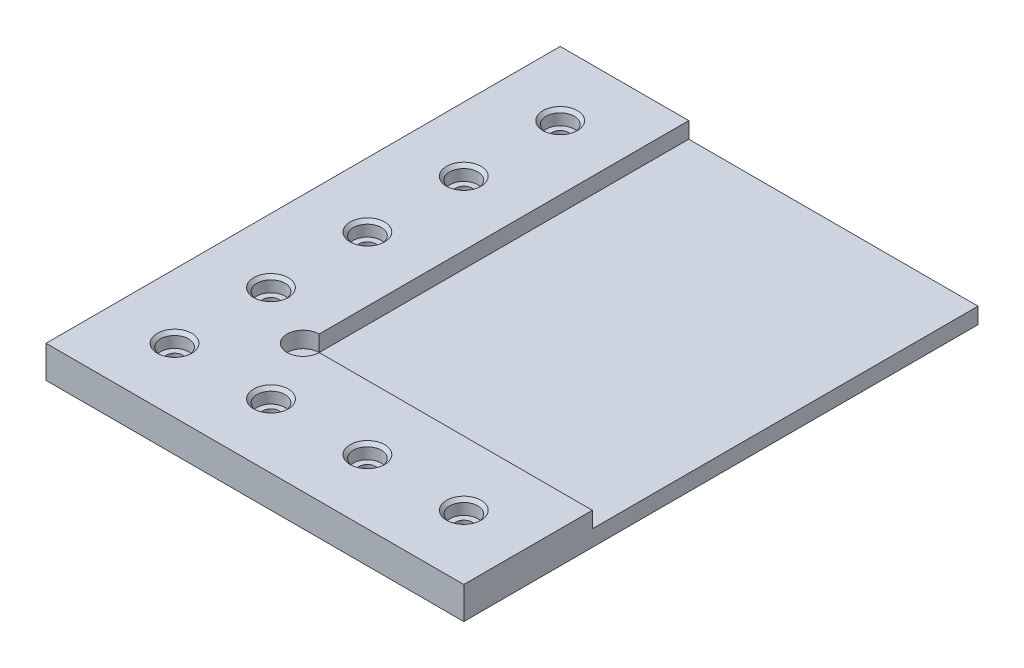
ISO-10303-21;
HEADER;
FILE_DESCRIPTION(('STEP AP214'),'2;1');
FILE_NAME('part.step','',(''),(''),'','','');
FILE_SCHEMA(('AUTOMOTIVE_DESIGN { 1 0 10303 214 1 1 1 1 }'));
ENDSEC;
DATA;
#1=APPLICATION_CONTEXT('core data for automotive mechanical design processes');
#2=APPLICATION_PROTOCOL_DEFINITION('international standard','automotive_design',2000,#1);
#3=PRODUCT_CONTEXT('',#1,'mechanical');
#4=PRODUCT('Part','Part','',(#3));
#5=PRODUCT_RELATED_PRODUCT_CATEGORY('part','',(#4));
#6=PRODUCT_DEFINITION_FORMATION('','',#4);
#7=PRODUCT_DEFINITION_CONTEXT('part definition',#1,'design');
#8=PRODUCT_DEFINITION('design','',#6,#7);
#9=PRODUCT_DEFINITION_SHAPE('','',#8);
#10=(LENGTH_UNIT() NAMED_UNIT(*) SI_UNIT(.MILLI.,.METRE.));
#11=(NAMED_UNIT(*) PLANE_ANGLE_UNIT() SI_UNIT($,.RADIAN.));
#12=(NAMED_UNIT(*) SI_UNIT($,.STERADIAN.) SOLID_ANGLE_UNIT());
#13=UNCERTAINTY_MEASURE_WITH_UNIT(LENGTH_MEASURE(1.E-05),#10,'distance_accuracy_value','');
#14=(GEOMETRIC_REPRESENTATION_CONTEXT(3) GLOBAL_UNCERTAINTY_ASSIGNED_CONTEXT((#13)) GLOBAL_UNIT_ASSIGNED_CONTEXT((#10,
#11,#12)) REPRESENTATION_CONTEXT('',''));
#15=CARTESIAN_POINT('',(0.,0.,0.));
#16=DIRECTION('',(0.,0.,1.));
#17=DIRECTION('',(1.,0.,0.));
#18=AXIS2_PLACEMENT_3D('',#15,#16,#17);
#19=CARTESIAN_POINT('',(41.275,6.35,-50.8));
#20=DIRECTION('',(-1.,0.,0.));
#21=DIRECTION('',(0.,0.,1.));
#22=AXIS2_PLACEMENT_3D('',#19,#20,#21);
#23=PLANE('',#22);
#24=DIRECTION('',(0.,0.,-1.));
#25=VECTOR('',#24,1.);
#26=CARTESIAN_POINT('',(41.275,3.175,-50.8));
#27=LINE('',#26,#25);
#28=CARTESIAN_POINT('',(41.275,3.175,25.4));
#29=VERTEX_POINT('',#28);
#30=CARTESIAN_POINT('',(41.275,3.175,-50.8));
#31=VERTEX_POINT('',#30);
#32=EDGE_CURVE('E145',#29,#31,#27,.T.);
#33=ORIENTED_EDGE('',*,*,#32,.F.);
#34=DIRECTION('',(0.,1.,0.));
#35=VECTOR('',#34,1.);
#36=CARTESIAN_POINT('',(41.275,3.175,25.4));
#37=LINE('',#36,#35);
#38=CARTESIAN_POINT('',(41.275,6.35,25.4));
#39=VERTEX_POINT('',#38);
#40=EDGE_CURVE('E134',#29,#39,#37,.T.);
#41=ORIENTED_EDGE('',*,*,#40,.T.);
#42=DIRECTION('',(0.,0.,-1.));
#43=VECTOR('',#42,1.);
#44=CARTESIAN_POINT('',(41.275,6.35,-50.8));
#45=LINE('',#44,#43);
#46=CARTESIAN_POINT('',(41.275,6.35,50.8));
#47=VERTEX_POINT('',#46);
#48=EDGE_CURVE('E268',#47,#39,#45,.T.);
#49=ORIENTED_EDGE('',*,*,#48,.F.);
#50=DIRECTION('',(0.,-1.,0.));
#51=VECTOR('',#50,1.);
#52=CARTESIAN_POINT('',(41.275,6.35,50.8));
#53=LINE('',#52,#51);
#54=CARTESIAN_POINT('',(41.275,0.,50.8));
#55=VERTEX_POINT('',#54);
#56=EDGE_CURVE('E274',#47,#55,#53,.T.);
#57=ORIENTED_EDGE('',*,*,#56,.T.);
#58=DIRECTION('',(0.,0.,-1.));
#59=VECTOR('',#58,1.);
#60=CARTESIAN_POINT('',(41.275,0.,-50.8));
#61=LINE('',#60,#59);
#62=CARTESIAN_POINT('',(41.275,0.,-50.8));
#63=VERTEX_POINT('',#62);
#64=EDGE_CURVE('E267',#55,#63,#61,.T.);
#65=ORIENTED_EDGE('',*,*,#64,.T.);
#66=DIRECTION('',(0.,-1.,0.));
#67=VECTOR('',#66,1.);
#68=CARTESIAN_POINT('',(41.275,6.35,-50.8));
#69=LINE('',#68,#67);
#70=EDGE_CURVE('E11',#31,#63,#69,.T.);
#71=ORIENTED_EDGE('',*,*,#70,.F.);
#72=EDGE_LOOP('',(#33,#41,#49,#57,#65,#71));
#73=FACE_BOUND('',#72,.T.);
#74=ADVANCED_FACE('F39',(#73),#23,.F.);
#75=CARTESIAN_POINT('',(-41.275,6.35,-50.8));
#76=DIRECTION('',(0.,0.,1.));
#77=DIRECTION('',(1.,0.,0.));
#78=AXIS2_PLACEMENT_3D('',#75,#76,#77);
#79=PLANE('',#78);
#80=DIRECTION('',(-1.,0.,0.));
#81=VECTOR('',#80,1.);
#82=CARTESIAN_POINT('',(-41.275,6.35,-50.8));
#83=LINE('',#82,#81);
#84=CARTESIAN_POINT('',(-15.875,6.35,-50.8));
#85=VERTEX_POINT('',#84);
#86=CARTESIAN_POINT('',(-41.275,6.35,-50.8));
#87=VERTEX_POINT('',#86);
#88=EDGE_CURVE('E85',#85,#87,#83,.T.);
#89=ORIENTED_EDGE('',*,*,#88,.F.);
#90=DIRECTION('',(0.,1.,0.));
#91=VECTOR('',#90,1.);
#92=CARTESIAN_POINT('',(-15.875,3.175,-50.8));
#93=LINE('',#92,#91);
#94=CARTESIAN_POINT('',(-15.875,3.175,-50.8));
#95=VERTEX_POINT('',#94);
#96=EDGE_CURVE('E53',#95,#85,#93,.T.);
#97=ORIENTED_EDGE('',*,*,#96,.F.);
#98=DIRECTION('',(-1.,0.,0.));
#99=VECTOR('',#98,1.);
#100=CARTESIAN_POINT('',(41.275,3.175,-50.8));
#101=LINE('',#100,#99);
#102=EDGE_CURVE('E138',#31,#95,#101,.T.);
#103=ORIENTED_EDGE('',*,*,#102,.F.);
#104=ORIENTED_EDGE('',*,*,#70,.T.);
#105=DIRECTION('',(-1.,0.,0.));
#106=VECTOR('',#105,1.);
#107=CARTESIAN_POINT('',(-41.275,0.,-50.8));
#108=LINE('',#107,#106);
#109=CARTESIAN_POINT('',(-41.275,0.,-50.8));
#110=VERTEX_POINT('',#109);
#111=EDGE_CURVE('E277',#63,#110,#108,.T.);
#112=ORIENTED_EDGE('',*,*,#111,.T.);
#113=DIRECTION('',(0.,-1.,0.));
#114=VECTOR('',#113,1.);
#115=CARTESIAN_POINT('',(-41.275,6.35,-50.8));
#116=LINE('',#115,#114);
#117=EDGE_CURVE('E46',#87,#110,#116,.T.);
#118=ORIENTED_EDGE('',*,*,#117,.F.);
#119=EDGE_LOOP('',(#89,#97,#103,#104,#112,#118));
#120=FACE_BOUND('',#119,.T.);
#121=ADVANCED_FACE('F308',(#120),#79,.F.);
#122=CARTESIAN_POINT('',(-41.275,6.35,-50.8));
#123=DIRECTION('',(1.,0.,0.));
#124=DIRECTION('',(0.,0.,-1.));
#125=AXIS2_PLACEMENT_3D('',#122,#123,#124);
#126=PLANE('',#125);
#127=DIRECTION('',(0.,0.,1.));
#128=VECTOR('',#127,1.);
#129=CARTESIAN_POINT('',(-41.275,0.,-50.8));
#130=LINE('',#129,#128);
#131=CARTESIAN_POINT('',(-41.275,0.,50.8));
#132=VERTEX_POINT('',#131);
#133=EDGE_CURVE('E279',#110,#132,#130,.T.);
#134=ORIENTED_EDGE('',*,*,#133,.T.);
#135=DIRECTION('',(0.,-1.,0.));
#136=VECTOR('',#135,1.);
#137=CARTESIAN_POINT('',(-41.275,6.35,50.8));
#138=LINE('',#137,#136);
#139=CARTESIAN_POINT('',(-41.275,6.35,50.8));
#140=VERTEX_POINT('',#139);
#141=EDGE_CURVE('E283',#140,#132,#138,.T.);
#142=ORIENTED_EDGE('',*,*,#141,.F.);
#143=DIRECTION('',(0.,0.,1.));
#144=VECTOR('',#143,1.);
#145=CARTESIAN_POINT('',(-41.275,6.35,-50.8));
#146=LINE('',#145,#144);
#147=EDGE_CURVE('E271',#87,#140,#146,.T.);
#148=ORIENTED_EDGE('',*,*,#147,.F.);
#149=ORIENTED_EDGE('',*,*,#117,.T.);
#150=EDGE_LOOP('',(#134,#142,#148,#149));
#151=FACE_BOUND('',#150,.T.);
#152=ADVANCED_FACE('F288',(#151),#126,.F.);
#153=CARTESIAN_POINT('',(-41.275,6.35,50.8));
#154=DIRECTION('',(0.,0.,-1.));
#155=DIRECTION('',(-1.,0.,0.));
#156=AXIS2_PLACEMENT_3D('',#153,#154,#155);
#157=PLANE('',#156);
#158=DIRECTION('',(1.,0.,0.));
#159=VECTOR('',#158,1.);
#160=CARTESIAN_POINT('',(-41.275,0.,50.8));
#161=LINE('',#160,#159);
#162=EDGE_CURVE('E81',#132,#55,#161,.T.);
#163=ORIENTED_EDGE('',*,*,#162,.T.);
#164=ORIENTED_EDGE('',*,*,#56,.F.);
#165=DIRECTION('',(1.,0.,0.));
#166=VECTOR('',#165,1.);
#167=CARTESIAN_POINT('',(-41.275,6.35,50.8));
#168=LINE('',#167,#166);
#169=EDGE_CURVE('E62',#140,#47,#168,.T.);
#170=ORIENTED_EDGE('',*,*,#169,.F.);
#171=ORIENTED_EDGE('',*,*,#141,.T.);
#172=EDGE_LOOP('',(#163,#164,#170,#171));
#173=FACE_BOUND('',#172,.T.);
#174=ADVANCED_FACE('F298',(#173),#157,.F.);
#175=CARTESIAN_POINT('',(0.,6.35,0.));
#176=DIRECTION('',(0.,1.,0.));
#177=DIRECTION('',(0.,0.,1.));
#178=AXIS2_PLACEMENT_3D('',#175,#176,#177);
#179=PLANE('',#178);
#180=CARTESIAN_POINT('',(-15.875,6.35,25.4));
#181=DIRECTION('',(0.,1.,0.));
#182=DIRECTION('',(0.,0.,1.));
#183=AXIS2_PLACEMENT_3D('',#180,#181,#182);
#184=CIRCLE('',#183,3.175);
#185=CARTESIAN_POINT('',(-15.875,6.35,22.225));
#186=VERTEX_POINT('',#185);
#187=CARTESIAN_POINT('',(-12.7,6.35,25.4));
#188=VERTEX_POINT('',#187);
#189=EDGE_CURVE('E117',#186,#188,#184,.T.);
#190=ORIENTED_EDGE('',*,*,#189,.F.);
#191=DIRECTION('',(0.,0.,1.));
#192=VECTOR('',#191,1.);
#193=CARTESIAN_POINT('',(-15.875,6.35,-50.8));
#194=LINE('',#193,#192);
#195=EDGE_CURVE('E121',#85,#186,#194,.T.);
#196=ORIENTED_EDGE('',*,*,#195,.F.);
#197=ORIENTED_EDGE('',*,*,#88,.T.);
#198=ORIENTED_EDGE('',*,*,#147,.T.);
#199=ORIENTED_EDGE('',*,*,#169,.T.);
#200=ORIENTED_EDGE('',*,*,#48,.T.);
#201=DIRECTION('',(1.,0.,0.));
#202=VECTOR('',#201,1.);
#203=CARTESIAN_POINT('',(41.275,6.35,25.4));
#204=LINE('',#203,#202);
#205=EDGE_CURVE('E143',#188,#39,#204,.T.);
#206=ORIENTED_EDGE('',*,*,#205,.F.);
#207=EDGE_LOOP('',(#190,#196,#197,#198,#199,#200,#206));
#208=FACE_BOUND('',#207,.T.);
#209=CARTESIAN_POINT('',(-28.575,6.35,38.1));
#210=DIRECTION('',(0.,1.,0.));
#211=DIRECTION('',(0.,0.,1.));
#212=AXIS2_PLACEMENT_3D('',#209,#210,#211);
#213=CIRCLE('',#212,3.41376);
#214=CARTESIAN_POINT('',(-28.575,6.35,41.51376));
#215=VERTEX_POINT('',#214);
#216=EDGE_CURVE('E146',#215,#215,#213,.T.);
#217=ORIENTED_EDGE('',*,*,#216,.F.);
#218=EDGE_LOOP('',(#217));
#219=FACE_BOUND('',#218,.T.);
#220=CARTESIAN_POINT('',(-9.52500000000001,6.35,38.1));
#221=DIRECTION('',(0.,1.,0.));
#222=DIRECTION('',(0.,0.,1.));
#223=AXIS2_PLACEMENT_3D('',#220,#221,#222);
#224=CIRCLE('',#223,3.41376);
#225=CARTESIAN_POINT('',(-9.52500000000001,6.35,41.51376));
#226=VERTEX_POINT('',#225);
#227=EDGE_CURVE('E162',#226,#226,#224,.T.);
#228=ORIENTED_EDGE('',*,*,#227,.F.);
#229=EDGE_LOOP('',(#228));
#230=FACE_BOUND('',#229,.T.);
#231=CARTESIAN_POINT('',(9.525,6.35,38.1));
#232=DIRECTION('',(0.,1.,0.));
#233=DIRECTION('',(0.,0.,1.));
#234=AXIS2_PLACEMENT_3D('',#231,#232,#233);
#235=CIRCLE('',#234,3.41376);
#236=CARTESIAN_POINT('',(9.525,6.35,41.51376));
#237=VERTEX_POINT('',#236);
#238=EDGE_CURVE('E177',#237,#237,#235,.T.);
#239=ORIENTED_EDGE('',*,*,#238,.F.);
#240=EDGE_LOOP('',(#239));
#241=FACE_BOUND('',#240,.T.);
#242=CARTESIAN_POINT('',(28.575,6.35,38.1));
#243=DIRECTION('',(0.,1.,0.));
#244=DIRECTION('',(0.,0.,1.));
#245=AXIS2_PLACEMENT_3D('',#242,#243,#244);
#246=CIRCLE('',#245,3.41376);
#247=CARTESIAN_POINT('',(28.575,6.35,41.51376));
#248=VERTEX_POINT('',#247);
#249=EDGE_CURVE('E192',#248,#248,#246,.T.);
#250=ORIENTED_EDGE('',*,*,#249,.F.);
#251=EDGE_LOOP('',(#250));
#252=FACE_BOUND('',#251,.T.);
#253=CARTESIAN_POINT('',(-28.575,6.35,19.05));
#254=DIRECTION('',(0.,1.,0.));
#255=DIRECTION('',(0.,0.,1.));
#256=AXIS2_PLACEMENT_3D('',#253,#254,#255);
#257=CIRCLE('',#256,3.41376);
#258=CARTESIAN_POINT('',(-28.575,6.35,22.46376));
#259=VERTEX_POINT('',#258);
#260=EDGE_CURVE('E207',#259,#259,#257,.T.);
#261=ORIENTED_EDGE('',*,*,#260,.F.);
#262=EDGE_LOOP('',(#261));
#263=FACE_BOUND('',#262,.T.);
#264=CARTESIAN_POINT('',(-28.575,6.35,0.));
#265=DIRECTION('',(0.,1.,0.));
#266=DIRECTION('',(0.,0.,1.));
#267=AXIS2_PLACEMENT_3D('',#264,#265,#266);
#268=CIRCLE('',#267,3.41376);
#269=CARTESIAN_POINT('',(-28.575,6.35,3.41376000000001));
#270=VERTEX_POINT('',#269);
#271=EDGE_CURVE('E222',#270,#270,#268,.T.);
#272=ORIENTED_EDGE('',*,*,#271,.F.);
#273=EDGE_LOOP('',(#272));
#274=FACE_BOUND('',#273,.T.);
#275=CARTESIAN_POINT('',(-28.575,6.35,-19.05));
#276=DIRECTION('',(0.,1.,0.));
#277=DIRECTION('',(0.,0.,1.));
#278=AXIS2_PLACEMENT_3D('',#275,#276,#277);
#279=CIRCLE('',#278,3.41376);
#280=CARTESIAN_POINT('',(-28.575,6.35,-15.63624));
#281=VERTEX_POINT('',#280);
#282=EDGE_CURVE('E237',#281,#281,#279,.T.);
#283=ORIENTED_EDGE('',*,*,#282,.F.);
#284=EDGE_LOOP('',(#283));
#285=FACE_BOUND('',#284,.T.);
#286=CARTESIAN_POINT('',(-28.575,6.35,-38.1));
#287=DIRECTION('',(0.,1.,0.));
#288=DIRECTION('',(0.,0.,1.));
#289=AXIS2_PLACEMENT_3D('',#286,#287,#288);
#290=CIRCLE('',#289,3.41376);
#291=CARTESIAN_POINT('',(-28.575,6.35,-34.68624));
#292=VERTEX_POINT('',#291);
#293=EDGE_CURVE('E252',#292,#292,#290,.T.);
#294=ORIENTED_EDGE('',*,*,#293,.F.);
#295=EDGE_LOOP('',(#294));
#296=FACE_BOUND('',#295,.T.);
#297=ADVANCED_FACE('F300',(#208,#219,#230,#241,#252,#263,#274,#285,#296),#179,.T.);
#298=CARTESIAN_POINT('',(0.,0.,0.));
#299=DIRECTION('',(0.,1.,0.));
#300=DIRECTION('',(0.,0.,1.));
#301=AXIS2_PLACEMENT_3D('',#298,#299,#300);
#302=PLANE('',#301);
#303=CARTESIAN_POINT('',(-28.575,0.,38.1));
#304=DIRECTION('',(0.,1.,0.));
#305=DIRECTION('',(0.,0.,1.));
#306=AXIS2_PLACEMENT_3D('',#303,#304,#305);
#307=CIRCLE('',#306,1.63195);
#308=CARTESIAN_POINT('',(-28.575,0.,39.73195));
#309=VERTEX_POINT('',#308);
#310=EDGE_CURVE('E159',#309,#309,#307,.T.);
#311=ORIENTED_EDGE('',*,*,#310,.T.);
#312=EDGE_LOOP('',(#311));
#313=FACE_BOUND('',#312,.T.);
#314=CARTESIAN_POINT('',(-9.52500000000001,0.,38.1));
#315=DIRECTION('',(0.,1.,0.));
#316=DIRECTION('',(0.,0.,1.));
#317=AXIS2_PLACEMENT_3D('',#314,#315,#316);
#318=CIRCLE('',#317,1.63195);
#319=CARTESIAN_POINT('',(-9.52500000000001,0.,39.73195));
#320=VERTEX_POINT('',#319);
#321=EDGE_CURVE('E174',#320,#320,#318,.T.);
#322=ORIENTED_EDGE('',*,*,#321,.T.);
#323=EDGE_LOOP('',(#322));
#324=FACE_BOUND('',#323,.T.);
#325=CARTESIAN_POINT('',(9.525,0.,38.1));
#326=DIRECTION('',(0.,1.,0.));
#327=DIRECTION('',(0.,0.,1.));
#328=AXIS2_PLACEMENT_3D('',#325,#326,#327);
#329=CIRCLE('',#328,1.63195);
#330=CARTESIAN_POINT('',(9.525,0.,39.73195));
#331=VERTEX_POINT('',#330);
#332=EDGE_CURVE('E189',#331,#331,#329,.T.);
#333=ORIENTED_EDGE('',*,*,#332,.T.);
#334=EDGE_LOOP('',(#333));
#335=FACE_BOUND('',#334,.T.);
#336=CARTESIAN_POINT('',(28.575,0.,38.1));
#337=DIRECTION('',(0.,1.,0.));
#338=DIRECTION('',(0.,0.,1.));
#339=AXIS2_PLACEMENT_3D('',#336,#337,#338);
#340=CIRCLE('',#339,1.63195);
#341=CARTESIAN_POINT('',(28.575,0.,39.73195));
#342=VERTEX_POINT('',#341);
#343=EDGE_CURVE('E204',#342,#342,#340,.T.);
#344=ORIENTED_EDGE('',*,*,#343,.T.);
#345=EDGE_LOOP('',(#344));
#346=FACE_BOUND('',#345,.T.);
#347=CARTESIAN_POINT('',(-28.575,0.,19.05));
#348=DIRECTION('',(0.,1.,0.));
#349=DIRECTION('',(0.,0.,1.));
#350=AXIS2_PLACEMENT_3D('',#347,#348,#349);
#351=CIRCLE('',#350,1.63195);
#352=CARTESIAN_POINT('',(-28.575,0.,20.68195));
#353=VERTEX_POINT('',#352);
#354=EDGE_CURVE('E219',#353,#353,#351,.T.);
#355=ORIENTED_EDGE('',*,*,#354,.T.);
#356=EDGE_LOOP('',(#355));
#357=FACE_BOUND('',#356,.T.);
#358=CARTESIAN_POINT('',(-28.575,0.,0.));
#359=DIRECTION('',(0.,1.,0.));
#360=DIRECTION('',(0.,0.,1.));
#361=AXIS2_PLACEMENT_3D('',#358,#359,#360);
#362=CIRCLE('',#361,1.63195);
#363=CARTESIAN_POINT('',(-28.575,0.,1.63195000000001));
#364=VERTEX_POINT('',#363);
#365=EDGE_CURVE('E234',#364,#364,#362,.T.);
#366=ORIENTED_EDGE('',*,*,#365,.T.);
#367=EDGE_LOOP('',(#366));
#368=FACE_BOUND('',#367,.T.);
#369=CARTESIAN_POINT('',(-28.575,0.,-19.05));
#370=DIRECTION('',(0.,1.,0.));
#371=DIRECTION('',(0.,0.,1.));
#372=AXIS2_PLACEMENT_3D('',#369,#370,#371);
#373=CIRCLE('',#372,1.63195);
#374=CARTESIAN_POINT('',(-28.575,0.,-17.41805));
#375=VERTEX_POINT('',#374);
#376=EDGE_CURVE('E249',#375,#375,#373,.T.);
#377=ORIENTED_EDGE('',*,*,#376,.T.);
#378=EDGE_LOOP('',(#377));
#379=FACE_BOUND('',#378,.T.);
#380=CARTESIAN_POINT('',(-28.575,0.,-38.1));
#381=DIRECTION('',(0.,1.,0.));
#382=DIRECTION('',(0.,0.,1.));
#383=AXIS2_PLACEMENT_3D('',#380,#381,#382);
#384=CIRCLE('',#383,1.63195);
#385=CARTESIAN_POINT('',(-28.575,0.,-36.46805));
#386=VERTEX_POINT('',#385);
#387=EDGE_CURVE('E264',#386,#386,#384,.T.);
#388=ORIENTED_EDGE('',*,*,#387,.T.);
#389=EDGE_LOOP('',(#388));
#390=FACE_BOUND('',#389,.T.);
#391=ORIENTED_EDGE('',*,*,#64,.F.);
#392=ORIENTED_EDGE('',*,*,#162,.F.);
#393=ORIENTED_EDGE('',*,*,#133,.F.);
#394=ORIENTED_EDGE('',*,*,#111,.F.);
#395=EDGE_LOOP('',(#391,#392,#393,#394));
#396=FACE_BOUND('',#395,.T.);
#397=ADVANCED_FACE('F294',(#313,#324,#335,#346,#357,#368,#379,#390,#396),#302,.F.);
#398=CARTESIAN_POINT('',(-28.575,6.35,-38.1));
#399=DIRECTION('',(0.,1.,0.));
#400=DIRECTION('',(0.,0.,1.));
#401=AXIS2_PLACEMENT_3D('',#398,#399,#400);
#402=CYLINDRICAL_SURFACE('',#401,1.63195000000001);
#403=ORIENTED_EDGE('',*,*,#387,.F.);
#404=EDGE_LOOP('',(#403));
#405=FACE_BOUND('',#404,.T.);
#406=CARTESIAN_POINT('',(-28.575,3.50520000000001,-38.1));
#407=DIRECTION('',(0.,1.,0.));
#408=DIRECTION('',(0.,0.,1.));
#409=AXIS2_PLACEMENT_3D('',#406,#407,#408);
#410=CIRCLE('',#409,1.63195000000001);
#411=CARTESIAN_POINT('',(-28.575,3.50520000000001,-36.46805));
#412=VERTEX_POINT('',#411);
#413=EDGE_CURVE('E261',#412,#412,#410,.T.);
#414=ORIENTED_EDGE('',*,*,#413,.T.);
#415=EDGE_LOOP('',(#414));
#416=FACE_BOUND('',#415,.T.);
#417=ADVANCED_FACE('F361',(#405,#416),#402,.F.);
#418=CARTESIAN_POINT('',(-25.79624,3.50520000000001,-38.1));
#419=DIRECTION('',(0.,-1.,0.));
#420=DIRECTION('',(0.,0.,-1.));
#421=AXIS2_PLACEMENT_3D('',#418,#419,#420);
#422=PLANE('',#421);
#423=ORIENTED_EDGE('',*,*,#413,.F.);
#424=EDGE_LOOP('',(#423));
#425=FACE_BOUND('',#424,.T.);
#426=CARTESIAN_POINT('',(-28.575,3.50520000000001,-38.1));
#427=DIRECTION('',(0.,1.,0.));
#428=DIRECTION('',(0.,0.,1.));
#429=AXIS2_PLACEMENT_3D('',#426,#427,#428);
#430=CIRCLE('',#429,2.77875999999999);
#431=CARTESIAN_POINT('',(-28.575,3.50520000000001,-35.32124));
#432=VERTEX_POINT('',#431);
#433=EDGE_CURVE('E258',#432,#432,#430,.T.);
#434=ORIENTED_EDGE('',*,*,#433,.T.);
#435=EDGE_LOOP('',(#434));
#436=FACE_BOUND('',#435,.T.);
#437=ADVANCED_FACE('F353',(#425,#436),#422,.F.);
#438=CARTESIAN_POINT('',(-28.575,6.35,-38.1));
#439=DIRECTION('',(0.,1.,0.));
#440=DIRECTION('',(0.,0.,1.));
#441=AXIS2_PLACEMENT_3D('',#438,#439,#440);
#442=CYLINDRICAL_SURFACE('',#441,2.77875999999999);
#443=ORIENTED_EDGE('',*,*,#433,.F.);
#444=EDGE_LOOP('',(#443));
#445=FACE_BOUND('',#444,.T.);
#446=CARTESIAN_POINT('',(-28.575,5.715,-38.1));
#447=DIRECTION('',(0.,1.,0.));
#448=DIRECTION('',(0.,0.,1.));
#449=AXIS2_PLACEMENT_3D('',#446,#447,#448);
#450=CIRCLE('',#449,2.77875999999999);
#451=CARTESIAN_POINT('',(-28.575,5.715,-35.32124));
#452=VERTEX_POINT('',#451);
#453=EDGE_CURVE('E255',#452,#452,#450,.T.);
#454=ORIENTED_EDGE('',*,*,#453,.T.);
#455=EDGE_LOOP('',(#454));
#456=FACE_BOUND('',#455,.T.);
#457=ADVANCED_FACE('F343',(#445,#456),#442,.F.);
#458=CARTESIAN_POINT('',(-28.575,6.35,-38.1));
#459=DIRECTION('',(0.,1.,0.));
#460=DIRECTION('',(0.,0.,1.));
#461=AXIS2_PLACEMENT_3D('',#458,#459,#460);
#462=CONICAL_SURFACE('',#461,3.41376,0.78539816339745);
#463=ORIENTED_EDGE('',*,*,#453,.F.);
#464=EDGE_LOOP('',(#463));
#465=FACE_BOUND('',#464,.T.);
#466=ORIENTED_EDGE('',*,*,#293,.T.);
#467=EDGE_LOOP('',(#466));
#468=FACE_BOUND('',#467,.T.);
#469=ADVANCED_FACE('F340',(#465,#468),#462,.F.);
#470=CARTESIAN_POINT('',(-28.575,6.35,-19.05));
#471=DIRECTION('',(0.,1.,0.));
#472=DIRECTION('',(0.,0.,1.));
#473=AXIS2_PLACEMENT_3D('',#470,#471,#472);
#474=CYLINDRICAL_SURFACE('',#473,1.63195000000001);
#475=ORIENTED_EDGE('',*,*,#376,.F.);
#476=EDGE_LOOP('',(#475));
#477=FACE_BOUND('',#476,.T.);
#478=CARTESIAN_POINT('',(-28.575,3.50520000000001,-19.05));
#479=DIRECTION('',(0.,1.,0.));
#480=DIRECTION('',(0.,0.,1.));
#481=AXIS2_PLACEMENT_3D('',#478,#479,#480);
#482=CIRCLE('',#481,1.63195000000001);
#483=CARTESIAN_POINT('',(-28.575,3.50520000000001,-17.41805));
#484=VERTEX_POINT('',#483);
#485=EDGE_CURVE('E246',#484,#484,#482,.T.);
#486=ORIENTED_EDGE('',*,*,#485,.T.);
#487=EDGE_LOOP('',(#486));
#488=FACE_BOUND('',#487,.T.);
#489=ADVANCED_FACE('F342',(#477,#488),#474,.F.);
#490=CARTESIAN_POINT('',(-25.79624,3.50520000000001,-19.05));
#491=DIRECTION('',(0.,-1.,0.));
#492=DIRECTION('',(0.,0.,-1.));
#493=AXIS2_PLACEMENT_3D('',#490,#491,#492);
#494=PLANE('',#493);
#495=ORIENTED_EDGE('',*,*,#485,.F.);
#496=EDGE_LOOP('',(#495));
#497=FACE_BOUND('',#496,.T.);
#498=CARTESIAN_POINT('',(-28.575,3.50520000000001,-19.05));
#499=DIRECTION('',(0.,1.,0.));
#500=DIRECTION('',(0.,0.,1.));
#501=AXIS2_PLACEMENT_3D('',#498,#499,#500);
#502=CIRCLE('',#501,2.77875999999999);
#503=CARTESIAN_POINT('',(-28.575,3.50520000000001,-16.27124));
#504=VERTEX_POINT('',#503);
#505=EDGE_CURVE('E243',#504,#504,#502,.T.);
#506=ORIENTED_EDGE('',*,*,#505,.T.);
#507=EDGE_LOOP('',(#506));
#508=FACE_BOUND('',#507,.T.);
#509=ADVANCED_FACE('F350',(#497,#508),#494,.F.);
#510=CARTESIAN_POINT('',(-28.575,6.35,-19.05));
#511=DIRECTION('',(0.,1.,0.));
#512=DIRECTION('',(0.,0.,1.));
#513=AXIS2_PLACEMENT_3D('',#510,#511,#512);
#514=CYLINDRICAL_SURFACE('',#513,2.77875999999999);
#515=ORIENTED_EDGE('',*,*,#505,.F.);
#516=EDGE_LOOP('',(#515));
#517=FACE_BOUND('',#516,.T.);
#518=CARTESIAN_POINT('',(-28.575,5.715,-19.05));
#519=DIRECTION('',(0.,1.,0.));
#520=DIRECTION('',(0.,0.,1.));
#521=AXIS2_PLACEMENT_3D('',#518,#519,#520);
#522=CIRCLE('',#521,2.77875999999999);
#523=CARTESIAN_POINT('',(-28.575,5.715,-16.27124));
#524=VERTEX_POINT('',#523);
#525=EDGE_CURVE('E240',#524,#524,#522,.T.);
#526=ORIENTED_EDGE('',*,*,#525,.T.);
#527=EDGE_LOOP('',(#526));
#528=FACE_BOUND('',#527,.T.);
#529=ADVANCED_FACE('F393',(#517,#528),#514,.F.);
#530=CARTESIAN_POINT('',(-28.575,6.35,-19.05));
#531=DIRECTION('',(0.,1.,0.));
#532=DIRECTION('',(0.,0.,1.));
#533=AXIS2_PLACEMENT_3D('',#530,#531,#532);
#534=CONICAL_SURFACE('',#533,3.41376,0.78539816339745);
#535=ORIENTED_EDGE('',*,*,#525,.F.);
#536=EDGE_LOOP('',(#535));
#537=FACE_BOUND('',#536,.T.);
#538=ORIENTED_EDGE('',*,*,#282,.T.);
#539=EDGE_LOOP('',(#538));
#540=FACE_BOUND('',#539,.T.);
#541=ADVANCED_FACE('F398',(#537,#540),#534,.F.);
#542=CARTESIAN_POINT('',(-28.575,6.35,0.));
#543=DIRECTION('',(0.,1.,0.));
#544=DIRECTION('',(0.,0.,1.));
#545=AXIS2_PLACEMENT_3D('',#542,#543,#544);
#546=CYLINDRICAL_SURFACE('',#545,1.63195000000001);
#547=ORIENTED_EDGE('',*,*,#365,.F.);
#548=EDGE_LOOP('',(#547));
#549=FACE_BOUND('',#548,.T.);
#550=CARTESIAN_POINT('',(-28.575,3.50520000000001,0.));
#551=DIRECTION('',(0.,1.,0.));
#552=DIRECTION('',(0.,0.,1.));
#553=AXIS2_PLACEMENT_3D('',#550,#551,#552);
#554=CIRCLE('',#553,1.63195000000001);
#555=CARTESIAN_POINT('',(-28.575,3.50520000000001,1.63195000000002));
#556=VERTEX_POINT('',#555);
#557=EDGE_CURVE('E231',#556,#556,#554,.T.);
#558=ORIENTED_EDGE('',*,*,#557,.T.);
#559=EDGE_LOOP('',(#558));
#560=FACE_BOUND('',#559,.T.);
#561=ADVANCED_FACE('F404',(#549,#560),#546,.F.);
#562=CARTESIAN_POINT('',(-25.79624,3.50520000000001,0.));
#563=DIRECTION('',(0.,-1.,0.));
#564=DIRECTION('',(0.,0.,-1.));
#565=AXIS2_PLACEMENT_3D('',#562,#563,#564);
#566=PLANE('',#565);
#567=ORIENTED_EDGE('',*,*,#557,.F.);
#568=EDGE_LOOP('',(#567));
#569=FACE_BOUND('',#568,.T.);
#570=CARTESIAN_POINT('',(-28.575,3.50520000000001,0.));
#571=DIRECTION('',(0.,1.,0.));
#572=DIRECTION('',(0.,0.,1.));
#573=AXIS2_PLACEMENT_3D('',#570,#571,#572);
#574=CIRCLE('',#573,2.77875999999999);
#575=CARTESIAN_POINT('',(-28.575,3.50520000000001,2.77876));
#576=VERTEX_POINT('',#575);
#577=EDGE_CURVE('E228',#576,#576,#574,.T.);
#578=ORIENTED_EDGE('',*,*,#577,.T.);
#579=EDGE_LOOP('',(#578));
#580=FACE_BOUND('',#579,.T.);
#581=ADVANCED_FACE('F409',(#569,#580),#566,.F.);
#582=CARTESIAN_POINT('',(-28.575,6.35,0.));
#583=DIRECTION('',(0.,1.,0.));
#584=DIRECTION('',(0.,0.,1.));
#585=AXIS2_PLACEMENT_3D('',#582,#583,#584);
#586=CYLINDRICAL_SURFACE('',#585,2.77875999999999);
#587=ORIENTED_EDGE('',*,*,#577,.F.);
#588=EDGE_LOOP('',(#587));
#589=FACE_BOUND('',#588,.T.);
#590=CARTESIAN_POINT('',(-28.575,5.715,0.));
#591=DIRECTION('',(0.,1.,0.));
#592=DIRECTION('',(0.,0.,1.));
#593=AXIS2_PLACEMENT_3D('',#590,#591,#592);
#594=CIRCLE('',#593,2.77875999999999);
#595=CARTESIAN_POINT('',(-28.575,5.715,2.77876));
#596=VERTEX_POINT('',#595);
#597=EDGE_CURVE('E225',#596,#596,#594,.T.);
#598=ORIENTED_EDGE('',*,*,#597,.T.);
#599=EDGE_LOOP('',(#598));
#600=FACE_BOUND('',#599,.T.);
#601=ADVANCED_FACE('F415',(#589,#600),#586,.F.);
#602=CARTESIAN_POINT('',(-28.575,6.35,0.));
#603=DIRECTION('',(0.,1.,0.));
#604=DIRECTION('',(0.,0.,1.));
#605=AXIS2_PLACEMENT_3D('',#602,#603,#604);
#606=CONICAL_SURFACE('',#605,3.41376,0.78539816339745);
#607=ORIENTED_EDGE('',*,*,#597,.F.);
#608=EDGE_LOOP('',(#607));
#609=FACE_BOUND('',#608,.T.);
#610=ORIENTED_EDGE('',*,*,#271,.T.);
#611=EDGE_LOOP('',(#610));
#612=FACE_BOUND('',#611,.T.);
#613=ADVANCED_FACE('F419',(#609,#612),#606,.F.);
#614=CARTESIAN_POINT('',(-28.575,6.35,19.05));
#615=DIRECTION('',(0.,1.,0.));
#616=DIRECTION('',(0.,0.,1.));
#617=AXIS2_PLACEMENT_3D('',#614,#615,#616);
#618=CYLINDRICAL_SURFACE('',#617,1.63195000000001);
#619=ORIENTED_EDGE('',*,*,#354,.F.);
#620=EDGE_LOOP('',(#619));
#621=FACE_BOUND('',#620,.T.);
#622=CARTESIAN_POINT('',(-28.575,3.50520000000001,19.05));
#623=DIRECTION('',(0.,1.,0.));
#624=DIRECTION('',(0.,0.,1.));
#625=AXIS2_PLACEMENT_3D('',#622,#623,#624);
#626=CIRCLE('',#625,1.63195000000001);
#627=CARTESIAN_POINT('',(-28.575,3.50520000000001,20.68195));
#628=VERTEX_POINT('',#627);
#629=EDGE_CURVE('E216',#628,#628,#626,.T.);
#630=ORIENTED_EDGE('',*,*,#629,.T.);
#631=EDGE_LOOP('',(#630));
#632=FACE_BOUND('',#631,.T.);
#633=ADVANCED_FACE('F423',(#621,#632),#618,.F.);
#634=CARTESIAN_POINT('',(-25.79624,3.50520000000001,19.05));
#635=DIRECTION('',(0.,-1.,0.));
#636=DIRECTION('',(0.,0.,-1.));
#637=AXIS2_PLACEMENT_3D('',#634,#635,#636);
#638=PLANE('',#637);
#639=ORIENTED_EDGE('',*,*,#629,.F.);
#640=EDGE_LOOP('',(#639));
#641=FACE_BOUND('',#640,.T.);
#642=CARTESIAN_POINT('',(-28.575,3.50520000000001,19.05));
#643=DIRECTION('',(0.,1.,0.));
#644=DIRECTION('',(0.,0.,1.));
#645=AXIS2_PLACEMENT_3D('',#642,#643,#644);
#646=CIRCLE('',#645,2.77875999999999);
#647=CARTESIAN_POINT('',(-28.575,3.50520000000001,21.82876));
#648=VERTEX_POINT('',#647);
#649=EDGE_CURVE('E213',#648,#648,#646,.T.);
#650=ORIENTED_EDGE('',*,*,#649,.T.);
#651=EDGE_LOOP('',(#650));
#652=FACE_BOUND('',#651,.T.);
#653=ADVANCED_FACE('F427',(#641,#652),#638,.F.);
#654=CARTESIAN_POINT('',(-28.575,6.35,19.05));
#655=DIRECTION('',(0.,1.,0.));
#656=DIRECTION('',(0.,0.,1.));
#657=AXIS2_PLACEMENT_3D('',#654,#655,#656);
#658=CYLINDRICAL_SURFACE('',#657,2.77875999999999);
#659=ORIENTED_EDGE('',*,*,#649,.F.);
#660=EDGE_LOOP('',(#659));
#661=FACE_BOUND('',#660,.T.);
#662=CARTESIAN_POINT('',(-28.575,5.715,19.05));
#663=DIRECTION('',(0.,1.,0.));
#664=DIRECTION('',(0.,0.,1.));
#665=AXIS2_PLACEMENT_3D('',#662,#663,#664);
#666=CIRCLE('',#665,2.77875999999999);
#667=CARTESIAN_POINT('',(-28.575,5.715,21.82876));
#668=VERTEX_POINT('',#667);
#669=EDGE_CURVE('E210',#668,#668,#666,.T.);
#670=ORIENTED_EDGE('',*,*,#669,.T.);
#671=EDGE_LOOP('',(#670));
#672=FACE_BOUND('',#671,.T.);
#673=ADVANCED_FACE('F431',(#661,#672),#658,.F.);
#674=CARTESIAN_POINT('',(-28.575,6.35,19.05));
#675=DIRECTION('',(0.,1.,0.));
#676=DIRECTION('',(0.,0.,1.));
#677=AXIS2_PLACEMENT_3D('',#674,#675,#676);
#678=CONICAL_SURFACE('',#677,3.41376,0.78539816339745);
#679=ORIENTED_EDGE('',*,*,#669,.F.);
#680=EDGE_LOOP('',(#679));
#681=FACE_BOUND('',#680,.T.);
#682=ORIENTED_EDGE('',*,*,#260,.T.);
#683=EDGE_LOOP('',(#682));
#684=FACE_BOUND('',#683,.T.);
#685=ADVANCED_FACE('F435',(#681,#684),#678,.F.);
#686=CARTESIAN_POINT('',(28.575,6.35,38.1));
#687=DIRECTION('',(0.,1.,0.));
#688=DIRECTION('',(0.,0.,1.));
#689=AXIS2_PLACEMENT_3D('',#686,#687,#688);
#690=CYLINDRICAL_SURFACE('',#689,1.63195000000001);
#691=ORIENTED_EDGE('',*,*,#343,.F.);
#692=EDGE_LOOP('',(#691));
#693=FACE_BOUND('',#692,.T.);
#694=CARTESIAN_POINT('',(28.575,3.50520000000001,38.1));
#695=DIRECTION('',(0.,1.,0.));
#696=DIRECTION('',(0.,0.,1.));
#697=AXIS2_PLACEMENT_3D('',#694,#695,#696);
#698=CIRCLE('',#697,1.63195000000001);
#699=CARTESIAN_POINT('',(28.575,3.50520000000001,39.73195));
#700=VERTEX_POINT('',#699);
#701=EDGE_CURVE('E201',#700,#700,#698,.T.);
#702=ORIENTED_EDGE('',*,*,#701,.T.);
#703=EDGE_LOOP('',(#702));
#704=FACE_BOUND('',#703,.T.);
#705=ADVANCED_FACE('F439',(#693,#704),#690,.F.);
#706=CARTESIAN_POINT('',(31.35376,3.50520000000001,38.1));
#707=DIRECTION('',(0.,-1.,0.));
#708=DIRECTION('',(0.,0.,-1.));
#709=AXIS2_PLACEMENT_3D('',#706,#707,#708);
#710=PLANE('',#709);
#711=ORIENTED_EDGE('',*,*,#701,.F.);
#712=EDGE_LOOP('',(#711));
#713=FACE_BOUND('',#712,.T.);
#714=CARTESIAN_POINT('',(28.575,3.50520000000001,38.1));
#715=DIRECTION('',(0.,1.,0.));
#716=DIRECTION('',(0.,0.,1.));
#717=AXIS2_PLACEMENT_3D('',#714,#715,#716);
#718=CIRCLE('',#717,2.77876);
#719=CARTESIAN_POINT('',(28.575,3.50520000000001,40.87876));
#720=VERTEX_POINT('',#719);
#721=EDGE_CURVE('E198',#720,#720,#718,.T.);
#722=ORIENTED_EDGE('',*,*,#721,.T.);
#723=EDGE_LOOP('',(#722));
#724=FACE_BOUND('',#723,.T.);
#725=ADVANCED_FACE('F443',(#713,#724),#710,.F.);
#726=CARTESIAN_POINT('',(28.575,6.35,38.1));
#727=DIRECTION('',(0.,1.,0.));
#728=DIRECTION('',(0.,0.,1.));
#729=AXIS2_PLACEMENT_3D('',#726,#727,#728);
#730=CYLINDRICAL_SURFACE('',#729,2.77876);
#731=ORIENTED_EDGE('',*,*,#721,.F.);
#732=EDGE_LOOP('',(#731));
#733=FACE_BOUND('',#732,.T.);
#734=CARTESIAN_POINT('',(28.575,5.715,38.1));
#735=DIRECTION('',(0.,1.,0.));
#736=DIRECTION('',(0.,0.,1.));
#737=AXIS2_PLACEMENT_3D('',#734,#735,#736);
#738=CIRCLE('',#737,2.77876);
#739=CARTESIAN_POINT('',(28.575,5.715,40.87876));
#740=VERTEX_POINT('',#739);
#741=EDGE_CURVE('E195',#740,#740,#738,.T.);
#742=ORIENTED_EDGE('',*,*,#741,.T.);
#743=EDGE_LOOP('',(#742));
#744=FACE_BOUND('',#743,.T.);
#745=ADVANCED_FACE('F447',(#733,#744),#730,.F.);
#746=CARTESIAN_POINT('',(28.575,6.35,38.1));
#747=DIRECTION('',(0.,1.,0.));
#748=DIRECTION('',(0.,0.,1.));
#749=AXIS2_PLACEMENT_3D('',#746,#747,#748);
#750=CONICAL_SURFACE('',#749,3.41376,0.785398163397444);
#751=ORIENTED_EDGE('',*,*,#741,.F.);
#752=EDGE_LOOP('',(#751));
#753=FACE_BOUND('',#752,.T.);
#754=ORIENTED_EDGE('',*,*,#249,.T.);
#755=EDGE_LOOP('',(#754));
#756=FACE_BOUND('',#755,.T.);
#757=ADVANCED_FACE('F451',(#753,#756),#750,.F.);
#758=CARTESIAN_POINT('',(9.525,6.35,38.1));
#759=DIRECTION('',(0.,1.,0.));
#760=DIRECTION('',(0.,0.,1.));
#761=AXIS2_PLACEMENT_3D('',#758,#759,#760);
#762=CYLINDRICAL_SURFACE('',#761,1.63195);
#763=ORIENTED_EDGE('',*,*,#332,.F.);
#764=EDGE_LOOP('',(#763));
#765=FACE_BOUND('',#764,.T.);
#766=CARTESIAN_POINT('',(9.525,3.50520000000001,38.1));
#767=DIRECTION('',(0.,1.,0.));
#768=DIRECTION('',(0.,0.,1.));
#769=AXIS2_PLACEMENT_3D('',#766,#767,#768);
#770=CIRCLE('',#769,1.63195000000001);
#771=CARTESIAN_POINT('',(9.525,3.50520000000001,39.73195));
#772=VERTEX_POINT('',#771);
#773=EDGE_CURVE('E186',#772,#772,#770,.T.);
#774=ORIENTED_EDGE('',*,*,#773,.T.);
#775=EDGE_LOOP('',(#774));
#776=FACE_BOUND('',#775,.T.);
#777=ADVANCED_FACE('F455',(#765,#776),#762,.F.);
#778=CARTESIAN_POINT('',(12.30376,3.50520000000001,38.1));
#779=DIRECTION('',(0.,-1.,0.));
#780=DIRECTION('',(0.,0.,-1.));
#781=AXIS2_PLACEMENT_3D('',#778,#779,#780);
#782=PLANE('',#781);
#783=ORIENTED_EDGE('',*,*,#773,.F.);
#784=EDGE_LOOP('',(#783));
#785=FACE_BOUND('',#784,.T.);
#786=CARTESIAN_POINT('',(9.525,3.50520000000001,38.1));
#787=DIRECTION('',(0.,1.,0.));
#788=DIRECTION('',(0.,0.,1.));
#789=AXIS2_PLACEMENT_3D('',#786,#787,#788);
#790=CIRCLE('',#789,2.77875999999999);
#791=CARTESIAN_POINT('',(9.525,3.50520000000001,40.87876));
#792=VERTEX_POINT('',#791);
#793=EDGE_CURVE('E183',#792,#792,#790,.T.);
#794=ORIENTED_EDGE('',*,*,#793,.T.);
#795=EDGE_LOOP('',(#794));
#796=FACE_BOUND('',#795,.T.);
#797=ADVANCED_FACE('F459',(#785,#796),#782,.F.);
#798=CARTESIAN_POINT('',(9.525,6.35,38.1));
#799=DIRECTION('',(0.,1.,0.));
#800=DIRECTION('',(0.,0.,1.));
#801=AXIS2_PLACEMENT_3D('',#798,#799,#800);
#802=CYLINDRICAL_SURFACE('',#801,2.77875999999999);
#803=ORIENTED_EDGE('',*,*,#793,.F.);
#804=EDGE_LOOP('',(#803));
#805=FACE_BOUND('',#804,.T.);
#806=CARTESIAN_POINT('',(9.525,5.715,38.1));
#807=DIRECTION('',(0.,1.,0.));
#808=DIRECTION('',(0.,0.,1.));
#809=AXIS2_PLACEMENT_3D('',#806,#807,#808);
#810=CIRCLE('',#809,2.77875999999999);
#811=CARTESIAN_POINT('',(9.525,5.715,40.87876));
#812=VERTEX_POINT('',#811);
#813=EDGE_CURVE('E180',#812,#812,#810,.T.);
#814=ORIENTED_EDGE('',*,*,#813,.T.);
#815=EDGE_LOOP('',(#814));
#816=FACE_BOUND('',#815,.T.);
#817=ADVANCED_FACE('F463',(#805,#816),#802,.F.);
#818=CARTESIAN_POINT('',(9.525,6.35,38.1));
#819=DIRECTION('',(0.,1.,0.));
#820=DIRECTION('',(0.,0.,1.));
#821=AXIS2_PLACEMENT_3D('',#818,#819,#820);
#822=CONICAL_SURFACE('',#821,3.41376,0.78539816339745);
#823=ORIENTED_EDGE('',*,*,#813,.F.);
#824=EDGE_LOOP('',(#823));
#825=FACE_BOUND('',#824,.T.);
#826=ORIENTED_EDGE('',*,*,#238,.T.);
#827=EDGE_LOOP('',(#826));
#828=FACE_BOUND('',#827,.T.);
#829=ADVANCED_FACE('F467',(#825,#828),#822,.F.);
#830=CARTESIAN_POINT('',(-9.52500000000001,6.35,38.1));
#831=DIRECTION('',(0.,1.,0.));
#832=DIRECTION('',(0.,0.,1.));
#833=AXIS2_PLACEMENT_3D('',#830,#831,#832);
#834=CYLINDRICAL_SURFACE('',#833,1.63195);
#835=ORIENTED_EDGE('',*,*,#321,.F.);
#836=EDGE_LOOP('',(#835));
#837=FACE_BOUND('',#836,.T.);
#838=CARTESIAN_POINT('',(-9.52500000000001,3.50520000000001,38.1));
#839=DIRECTION('',(0.,1.,0.));
#840=DIRECTION('',(0.,0.,1.));
#841=AXIS2_PLACEMENT_3D('',#838,#839,#840);
#842=CIRCLE('',#841,1.63195000000001);
#843=CARTESIAN_POINT('',(-9.52500000000001,3.50520000000001,39.73195));
#844=VERTEX_POINT('',#843);
#845=EDGE_CURVE('E171',#844,#844,#842,.T.);
#846=ORIENTED_EDGE('',*,*,#845,.T.);
#847=EDGE_LOOP('',(#846));
#848=FACE_BOUND('',#847,.T.);
#849=ADVANCED_FACE('F471',(#837,#848),#834,.F.);
#850=CARTESIAN_POINT('',(-6.74624000000001,3.50520000000001,38.1));
#851=DIRECTION('',(0.,-1.,0.));
#852=DIRECTION('',(0.,0.,-1.));
#853=AXIS2_PLACEMENT_3D('',#850,#851,#852);
#854=PLANE('',#853);
#855=ORIENTED_EDGE('',*,*,#845,.F.);
#856=EDGE_LOOP('',(#855));
#857=FACE_BOUND('',#856,.T.);
#858=CARTESIAN_POINT('',(-9.52500000000001,3.50520000000001,38.1));
#859=DIRECTION('',(0.,1.,0.));
#860=DIRECTION('',(0.,0.,1.));
#861=AXIS2_PLACEMENT_3D('',#858,#859,#860);
#862=CIRCLE('',#861,2.77875999999999);
#863=CARTESIAN_POINT('',(-9.52500000000001,3.50520000000001,40.87876));
#864=VERTEX_POINT('',#863);
#865=EDGE_CURVE('E168',#864,#864,#862,.T.);
#866=ORIENTED_EDGE('',*,*,#865,.T.);
#867=EDGE_LOOP('',(#866));
#868=FACE_BOUND('',#867,.T.);
#869=ADVANCED_FACE('F475',(#857,#868),#854,.F.);
#870=CARTESIAN_POINT('',(-9.52500000000001,6.35,38.1));
#871=DIRECTION('',(0.,1.,0.));
#872=DIRECTION('',(0.,0.,1.));
#873=AXIS2_PLACEMENT_3D('',#870,#871,#872);
#874=CYLINDRICAL_SURFACE('',#873,2.77875999999999);
#875=ORIENTED_EDGE('',*,*,#865,.F.);
#876=EDGE_LOOP('',(#875));
#877=FACE_BOUND('',#876,.T.);
#878=CARTESIAN_POINT('',(-9.52500000000001,5.715,38.1));
#879=DIRECTION('',(0.,1.,0.));
#880=DIRECTION('',(0.,0.,1.));
#881=AXIS2_PLACEMENT_3D('',#878,#879,#880);
#882=CIRCLE('',#881,2.77875999999999);
#883=CARTESIAN_POINT('',(-9.52500000000001,5.715,40.87876));
#884=VERTEX_POINT('',#883);
#885=EDGE_CURVE('E165',#884,#884,#882,.T.);
#886=ORIENTED_EDGE('',*,*,#885,.T.);
#887=EDGE_LOOP('',(#886));
#888=FACE_BOUND('',#887,.T.);
#889=ADVANCED_FACE('F479',(#877,#888),#874,.F.);
#890=CARTESIAN_POINT('',(-9.52500000000001,6.35,38.1));
#891=DIRECTION('',(0.,1.,0.));
#892=DIRECTION('',(0.,0.,1.));
#893=AXIS2_PLACEMENT_3D('',#890,#891,#892);
#894=CONICAL_SURFACE('',#893,3.41376,0.78539816339745);
#895=ORIENTED_EDGE('',*,*,#885,.F.);
#896=EDGE_LOOP('',(#895));
#897=FACE_BOUND('',#896,.T.);
#898=ORIENTED_EDGE('',*,*,#227,.T.);
#899=EDGE_LOOP('',(#898));
#900=FACE_BOUND('',#899,.T.);
#901=ADVANCED_FACE('F483',(#897,#900),#894,.F.);
#902=CARTESIAN_POINT('',(-28.575,6.35,38.1));
#903=DIRECTION('',(0.,1.,0.));
#904=DIRECTION('',(0.,0.,1.));
#905=AXIS2_PLACEMENT_3D('',#902,#903,#904);
#906=CYLINDRICAL_SURFACE('',#905,1.63195000000001);
#907=ORIENTED_EDGE('',*,*,#310,.F.);
#908=EDGE_LOOP('',(#907));
#909=FACE_BOUND('',#908,.T.);
#910=CARTESIAN_POINT('',(-28.575,3.50520000000001,38.1));
#911=DIRECTION('',(0.,1.,0.));
#912=DIRECTION('',(0.,0.,1.));
#913=AXIS2_PLACEMENT_3D('',#910,#911,#912);
#914=CIRCLE('',#913,1.63195000000001);
#915=CARTESIAN_POINT('',(-28.575,3.50520000000001,39.73195));
#916=VERTEX_POINT('',#915);
#917=EDGE_CURVE('E156',#916,#916,#914,.T.);
#918=ORIENTED_EDGE('',*,*,#917,.T.);
#919=EDGE_LOOP('',(#918));
#920=FACE_BOUND('',#919,.T.);
#921=ADVANCED_FACE('F487',(#909,#920),#906,.F.);
#922=CARTESIAN_POINT('',(-25.79624,3.50520000000001,38.1));
#923=DIRECTION('',(0.,-1.,0.));
#924=DIRECTION('',(0.,0.,-1.));
#925=AXIS2_PLACEMENT_3D('',#922,#923,#924);
#926=PLANE('',#925);
#927=ORIENTED_EDGE('',*,*,#917,.F.);
#928=EDGE_LOOP('',(#927));
#929=FACE_BOUND('',#928,.T.);
#930=CARTESIAN_POINT('',(-28.575,3.50520000000001,38.1));
#931=DIRECTION('',(0.,1.,0.));
#932=DIRECTION('',(0.,0.,1.));
#933=AXIS2_PLACEMENT_3D('',#930,#931,#932);
#934=CIRCLE('',#933,2.77875999999999);
#935=CARTESIAN_POINT('',(-28.575,3.50520000000001,40.87876));
#936=VERTEX_POINT('',#935);
#937=EDGE_CURVE('E153',#936,#936,#934,.T.);
#938=ORIENTED_EDGE('',*,*,#937,.T.);
#939=EDGE_LOOP('',(#938));
#940=FACE_BOUND('',#939,.T.);
#941=ADVANCED_FACE('F491',(#929,#940),#926,.F.);
#942=CARTESIAN_POINT('',(-28.575,6.35,38.1));
#943=DIRECTION('',(0.,1.,0.));
#944=DIRECTION('',(0.,0.,1.));
#945=AXIS2_PLACEMENT_3D('',#942,#943,#944);
#946=CYLINDRICAL_SURFACE('',#945,2.77875999999999);
#947=ORIENTED_EDGE('',*,*,#937,.F.);
#948=EDGE_LOOP('',(#947));
#949=FACE_BOUND('',#948,.T.);
#950=CARTESIAN_POINT('',(-28.575,5.715,38.1));
#951=DIRECTION('',(0.,1.,0.));
#952=DIRECTION('',(0.,0.,1.));
#953=AXIS2_PLACEMENT_3D('',#950,#951,#952);
#954=CIRCLE('',#953,2.77875999999999);
#955=CARTESIAN_POINT('',(-28.575,5.715,40.87876));
#956=VERTEX_POINT('',#955);
#957=EDGE_CURVE('E150',#956,#956,#954,.T.);
#958=ORIENTED_EDGE('',*,*,#957,.T.);
#959=EDGE_LOOP('',(#958));
#960=FACE_BOUND('',#959,.T.);
#961=ADVANCED_FACE('F495',(#949,#960),#946,.F.);
#962=CARTESIAN_POINT('',(-28.575,6.35,38.1));
#963=DIRECTION('',(0.,1.,0.));
#964=DIRECTION('',(0.,0.,1.));
#965=AXIS2_PLACEMENT_3D('',#962,#963,#964);
#966=CONICAL_SURFACE('',#965,3.41376,0.78539816339745);
#967=ORIENTED_EDGE('',*,*,#957,.F.);
#968=EDGE_LOOP('',(#967));
#969=FACE_BOUND('',#968,.T.);
#970=ORIENTED_EDGE('',*,*,#216,.T.);
#971=EDGE_LOOP('',(#970));
#972=FACE_BOUND('',#971,.T.);
#973=ADVANCED_FACE('F499',(#969,#972),#966,.F.);
#974=CARTESIAN_POINT('',(41.275,3.175,25.4));
#975=DIRECTION('',(0.,0.,1.));
#976=DIRECTION('',(1.,0.,0.));
#977=AXIS2_PLACEMENT_3D('',#974,#975,#976);
#978=PLANE('',#977);
#979=DIRECTION('',(1.,0.,0.));
#980=VECTOR('',#979,1.);
#981=CARTESIAN_POINT('',(41.275,3.175,25.4));
#982=LINE('',#981,#980);
#983=CARTESIAN_POINT('',(-12.7,3.175,25.4));
#984=VERTEX_POINT('',#983);
#985=EDGE_CURVE('E127',#984,#29,#982,.T.);
#986=ORIENTED_EDGE('',*,*,#985,.F.);
#987=DIRECTION('',(0.,1.,0.));
#988=VECTOR('',#987,1.);
#989=CARTESIAN_POINT('',(-12.7,3.175,25.4));
#990=LINE('',#989,#988);
#991=EDGE_CURVE('E111',#984,#188,#990,.T.);
#992=ORIENTED_EDGE('',*,*,#991,.T.);
#993=ORIENTED_EDGE('',*,*,#205,.T.);
#994=ORIENTED_EDGE('',*,*,#40,.F.);
#995=EDGE_LOOP('',(#986,#992,#993,#994));
#996=FACE_BOUND('',#995,.T.);
#997=ADVANCED_FACE('F132',(#996),#978,.F.);
#998=CARTESIAN_POINT('',(-15.875,3.175,-50.8));
#999=DIRECTION('',(-1.,0.,0.));
#1000=DIRECTION('',(0.,0.,1.));
#1001=AXIS2_PLACEMENT_3D('',#998,#999,#1000);
#1002=PLANE('',#1001);
#1003=ORIENTED_EDGE('',*,*,#195,.T.);
#1004=DIRECTION('',(0.,1.,0.));
#1005=VECTOR('',#1004,1.);
#1006=CARTESIAN_POINT('',(-15.875,3.175,22.225));
#1007=LINE('',#1006,#1005);
#1008=CARTESIAN_POINT('',(-15.875,3.175,22.225));
#1009=VERTEX_POINT('',#1008);
#1010=EDGE_CURVE('E122',#186,#1009,#1007,.F.);
#1011=ORIENTED_EDGE('',*,*,#1010,.T.);
#1012=DIRECTION('',(0.,0.,1.));
#1013=VECTOR('',#1012,1.);
#1014=CARTESIAN_POINT('',(-15.875,3.175,-50.8));
#1015=LINE('',#1014,#1013);
#1016=EDGE_CURVE('E130',#95,#1009,#1015,.T.);
#1017=ORIENTED_EDGE('',*,*,#1016,.F.);
#1018=ORIENTED_EDGE('',*,*,#96,.T.);
#1019=EDGE_LOOP('',(#1003,#1011,#1017,#1018));
#1020=FACE_BOUND('',#1019,.T.);
#1021=ADVANCED_FACE('F322',(#1020),#1002,.F.);
#1022=CARTESIAN_POINT('',(0.,3.175,0.));
#1023=DIRECTION('',(0.,-1.,0.));
#1024=DIRECTION('',(0.,0.,-1.));
#1025=AXIS2_PLACEMENT_3D('',#1022,#1023,#1024);
#1026=PLANE('',#1025);
#1027=CARTESIAN_POINT('',(-15.875,3.175,25.4));
#1028=DIRECTION('',(0.,1.,0.));
#1029=DIRECTION('',(0.,0.,1.));
#1030=AXIS2_PLACEMENT_3D('',#1027,#1028,#1029);
#1031=CIRCLE('',#1030,3.175);
#1032=EDGE_CURVE('E114',#1009,#984,#1031,.T.);
#1033=ORIENTED_EDGE('',*,*,#1032,.T.);
#1034=ORIENTED_EDGE('',*,*,#985,.T.);
#1035=ORIENTED_EDGE('',*,*,#32,.T.);
#1036=ORIENTED_EDGE('',*,*,#102,.T.);
#1037=ORIENTED_EDGE('',*,*,#1016,.T.);
#1038=EDGE_LOOP('',(#1033,#1034,#1035,#1036,#1037));
#1039=FACE_BOUND('',#1038,.T.);
#1040=ADVANCED_FACE('F126',(#1039),#1026,.F.);
#1041=CARTESIAN_POINT('',(-15.875,3.175,25.4));
#1042=DIRECTION('',(0.,1.,0.));
#1043=DIRECTION('',(0.,0.,1.));
#1044=AXIS2_PLACEMENT_3D('',#1041,#1042,#1043);
#1045=CYLINDRICAL_SURFACE('',#1044,3.175);
#1046=ORIENTED_EDGE('',*,*,#1032,.F.);
#1047=ORIENTED_EDGE('',*,*,#1010,.F.);
#1048=ORIENTED_EDGE('',*,*,#189,.T.);
#1049=ORIENTED_EDGE('',*,*,#991,.F.);
#1050=EDGE_LOOP('',(#1046,#1047,#1048,#1049));
#1051=FACE_BOUND('',#1050,.T.);
#1052=ADVANCED_FACE('F113',(#1051),#1045,.F.);
#1053=CLOSED_SHELL('',(#74,#121,#152,#174,#297,#397,#417,#437,#457,#469,#489,#509,#529,#541,
#561,#581,#601,#613,#633,#653,#673,#685,#705,#725,#745,#757,#777,#797,#817,#829,#849,#869,#889,
#901,#921,#941,#961,#973,#997,#1021,#1040,#1052));
#1054=MANIFOLD_SOLID_BREP('B2',#1053);
#1055=ADVANCED_BREP_SHAPE_REPRESENTATION('',(#18,#1054),#14);
#1056=SHAPE_DEFINITION_REPRESENTATION(#9,#1055);
ENDSEC;
END-ISO-10303-21;
